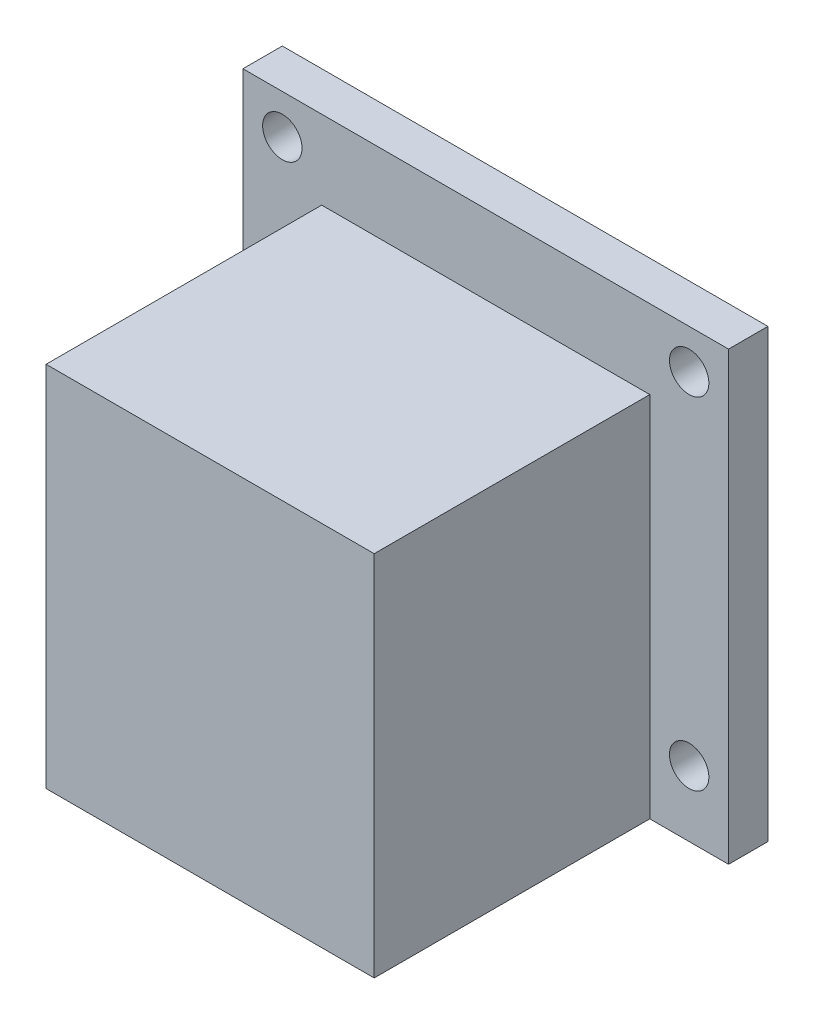
ISO-10303-21;
HEADER;
FILE_DESCRIPTION(('STEP AP214'),'2;1');
FILE_NAME('part.step','',(''),(''),'','','');
FILE_SCHEMA(('AUTOMOTIVE_DESIGN { 1 0 10303 214 1 1 1 1 }'));
ENDSEC;
DATA;
#1=APPLICATION_CONTEXT('core data for automotive mechanical design processes');
#2=APPLICATION_PROTOCOL_DEFINITION('international standard','automotive_design',2000,#1);
#3=PRODUCT_CONTEXT('',#1,'mechanical');
#4=PRODUCT('Part','Part','',(#3));
#5=PRODUCT_RELATED_PRODUCT_CATEGORY('part','',(#4));
#6=PRODUCT_DEFINITION_FORMATION('','',#4);
#7=PRODUCT_DEFINITION_CONTEXT('part definition',#1,'design');
#8=PRODUCT_DEFINITION('design','',#6,#7);
#9=PRODUCT_DEFINITION_SHAPE('','',#8);
#10=(LENGTH_UNIT() NAMED_UNIT(*) SI_UNIT(.MILLI.,.METRE.));
#11=(NAMED_UNIT(*) PLANE_ANGLE_UNIT() SI_UNIT($,.RADIAN.));
#12=(NAMED_UNIT(*) SI_UNIT($,.STERADIAN.) SOLID_ANGLE_UNIT());
#13=UNCERTAINTY_MEASURE_WITH_UNIT(LENGTH_MEASURE(1.E-05),#10,'distance_accuracy_value','');
#14=(GEOMETRIC_REPRESENTATION_CONTEXT(3) GLOBAL_UNCERTAINTY_ASSIGNED_CONTEXT((#13)) GLOBAL_UNIT_ASSIGNED_CONTEXT((#10,
#11,#12)) REPRESENTATION_CONTEXT('',''));
#15=CARTESIAN_POINT('',(0.,0.,0.));
#16=DIRECTION('',(0.,0.,1.));
#17=DIRECTION('',(1.,0.,0.));
#18=AXIS2_PLACEMENT_3D('',#15,#16,#17);
#19=CARTESIAN_POINT('',(0.,0.,0.));
#20=DIRECTION('',(0.,1.,0.));
#21=DIRECTION('',(0.,0.,1.));
#22=AXIS2_PLACEMENT_3D('',#19,#20,#21);
#23=PLANE('',#22);
#24=DIRECTION('',(-1.,0.,0.));
#25=VECTOR('',#24,1.);
#26=CARTESIAN_POINT('',(18.5,0.,-11.5));
#27=LINE('',#26,#25);
#28=CARTESIAN_POINT('',(18.5,0.,-11.5));
#29=VERTEX_POINT('',#28);
#30=CARTESIAN_POINT('',(10.5,0.,-11.5));
#31=VERTEX_POINT('',#30);
#32=EDGE_CURVE('E239',#29,#31,#27,.T.);
#33=ORIENTED_EDGE('',*,*,#32,.F.);
#34=DIRECTION('',(0.,0.,-1.));
#35=VECTOR('',#34,1.);
#36=CARTESIAN_POINT('',(18.5,0.,-8.5));
#37=LINE('',#36,#35);
#38=CARTESIAN_POINT('',(18.5,0.,-8.5));
#39=VERTEX_POINT('',#38);
#40=EDGE_CURVE('E191',#39,#29,#37,.T.);
#41=ORIENTED_EDGE('',*,*,#40,.F.);
#42=DIRECTION('',(-1.,0.,0.));
#43=VECTOR('',#42,1.);
#44=CARTESIAN_POINT('',(18.5,0.,-8.5));
#45=LINE('',#44,#43);
#46=CARTESIAN_POINT('',(12.5,0.,-8.5));
#47=VERTEX_POINT('',#46);
#48=EDGE_CURVE('E189',#39,#47,#45,.T.);
#49=ORIENTED_EDGE('',*,*,#48,.T.);
#50=DIRECTION('',(0.,0.,-1.));
#51=VECTOR('',#50,1.);
#52=CARTESIAN_POINT('',(12.5,0.,12.5));
#53=LINE('',#52,#51);
#54=CARTESIAN_POINT('',(12.5,0.,12.5));
#55=VERTEX_POINT('',#54);
#56=EDGE_CURVE('E176',#55,#47,#53,.T.);
#57=ORIENTED_EDGE('',*,*,#56,.F.);
#58=DIRECTION('',(1.,0.,0.));
#59=VECTOR('',#58,1.);
#60=CARTESIAN_POINT('',(12.5,0.,12.5));
#61=LINE('',#60,#59);
#62=CARTESIAN_POINT('',(-12.5,0.,12.5));
#63=VERTEX_POINT('',#62);
#64=EDGE_CURVE('E174',#63,#55,#61,.T.);
#65=ORIENTED_EDGE('',*,*,#64,.F.);
#66=DIRECTION('',(0.,0.,1.));
#67=VECTOR('',#66,1.);
#68=CARTESIAN_POINT('',(-12.5,0.,12.5));
#69=LINE('',#68,#67);
#70=CARTESIAN_POINT('',(-12.5,0.,-8.5));
#71=VERTEX_POINT('',#70);
#72=EDGE_CURVE('E164',#71,#63,#69,.T.);
#73=ORIENTED_EDGE('',*,*,#72,.F.);
#74=DIRECTION('',(-1.,0.,0.));
#75=VECTOR('',#74,1.);
#76=CARTESIAN_POINT('',(-12.5,0.,-8.49999999999999));
#77=LINE('',#76,#75);
#78=CARTESIAN_POINT('',(-18.5,0.,-8.49999999999999));
#79=VERTEX_POINT('',#78);
#80=EDGE_CURVE('E216',#71,#79,#77,.T.);
#81=ORIENTED_EDGE('',*,*,#80,.T.);
#82=DIRECTION('',(0.,0.,-1.));
#83=VECTOR('',#82,1.);
#84=CARTESIAN_POINT('',(-18.5,0.,-8.49999999999999));
#85=LINE('',#84,#83);
#86=CARTESIAN_POINT('',(-18.5,0.,-11.5));
#87=VERTEX_POINT('',#86);
#88=EDGE_CURVE('E143',#79,#87,#85,.T.);
#89=ORIENTED_EDGE('',*,*,#88,.T.);
#90=DIRECTION('',(-1.,0.,0.));
#91=VECTOR('',#90,1.);
#92=CARTESIAN_POINT('',(-10.5,0.,-11.5));
#93=LINE('',#92,#91);
#94=CARTESIAN_POINT('',(-10.5,0.,-11.5));
#95=VERTEX_POINT('',#94);
#96=EDGE_CURVE('E54',#95,#87,#93,.T.);
#97=ORIENTED_EDGE('',*,*,#96,.F.);
#98=DIRECTION('',(0.,0.,1.));
#99=VECTOR('',#98,1.);
#100=CARTESIAN_POINT('',(-10.5,0.,0.));
#101=LINE('',#100,#99);
#102=CARTESIAN_POINT('',(-10.5,0.,10.5));
#103=VERTEX_POINT('',#102);
#104=EDGE_CURVE('E140',#95,#103,#101,.T.);
#105=ORIENTED_EDGE('',*,*,#104,.T.);
#106=DIRECTION('',(1.,0.,0.));
#107=VECTOR('',#106,1.);
#108=CARTESIAN_POINT('',(0.,0.,10.5));
#109=LINE('',#108,#107);
#110=CARTESIAN_POINT('',(10.5,0.,10.5));
#111=VERTEX_POINT('',#110);
#112=EDGE_CURVE('E150',#103,#111,#109,.T.);
#113=ORIENTED_EDGE('',*,*,#112,.T.);
#114=DIRECTION('',(0.,0.,-1.));
#115=VECTOR('',#114,1.);
#116=CARTESIAN_POINT('',(10.5,0.,0.));
#117=LINE('',#116,#115);
#118=EDGE_CURVE('E153',#111,#31,#117,.T.);
#119=ORIENTED_EDGE('',*,*,#118,.T.);
#120=EDGE_LOOP('',(#33,#41,#49,#57,#65,#73,#81,#89,#97,#105,#113,#119));
#121=FACE_BOUND('',#120,.T.);
#122=ADVANCED_FACE('F39',(#121),#23,.F.);
#123=CARTESIAN_POINT('',(-10.5,25.,12.5));
#124=DIRECTION('',(1.,0.,0.));
#125=DIRECTION('',(0.,0.,-1.));
#126=AXIS2_PLACEMENT_3D('',#123,#124,#125);
#127=PLANE('',#126);
#128=ORIENTED_EDGE('',*,*,#104,.F.);
#129=DIRECTION('',(0.,-1.,0.));
#130=VECTOR('',#129,1.);
#131=CARTESIAN_POINT('',(-10.5,23.,-11.5));
#132=LINE('',#131,#130);
#133=CARTESIAN_POINT('',(-10.5,23.,-11.5));
#134=VERTEX_POINT('',#133);
#135=EDGE_CURVE('E127',#134,#95,#132,.T.);
#136=ORIENTED_EDGE('',*,*,#135,.F.);
#137=DIRECTION('',(0.,0.,1.));
#138=VECTOR('',#137,1.);
#139=CARTESIAN_POINT('',(-10.5,23.,12.5));
#140=LINE('',#139,#138);
#141=CARTESIAN_POINT('',(-10.5,23.,10.5));
#142=VERTEX_POINT('',#141);
#143=EDGE_CURVE('E162',#134,#142,#140,.T.);
#144=ORIENTED_EDGE('',*,*,#143,.T.);
#145=DIRECTION('',(0.,-1.,0.));
#146=VECTOR('',#145,1.);
#147=CARTESIAN_POINT('',(-10.5,25.,10.5));
#148=LINE('',#147,#146);
#149=EDGE_CURVE('E148',#142,#103,#148,.T.);
#150=ORIENTED_EDGE('',*,*,#149,.T.);
#151=EDGE_LOOP('',(#128,#136,#144,#150));
#152=FACE_BOUND('',#151,.T.);
#153=ADVANCED_FACE('F146',(#152),#127,.T.);
#154=CARTESIAN_POINT('',(10.5,25.,12.5));
#155=DIRECTION('',(-1.,0.,0.));
#156=DIRECTION('',(0.,0.,1.));
#157=AXIS2_PLACEMENT_3D('',#154,#155,#156);
#158=PLANE('',#157);
#159=DIRECTION('',(0.,0.,-1.));
#160=VECTOR('',#159,1.);
#161=CARTESIAN_POINT('',(10.5,23.,12.5));
#162=LINE('',#161,#160);
#163=CARTESIAN_POINT('',(10.5,23.,10.5));
#164=VERTEX_POINT('',#163);
#165=CARTESIAN_POINT('',(10.5,23.,-11.5));
#166=VERTEX_POINT('',#165);
#167=EDGE_CURVE('E169',#164,#166,#162,.T.);
#168=ORIENTED_EDGE('',*,*,#167,.T.);
#169=DIRECTION('',(0.,1.,0.));
#170=VECTOR('',#169,1.);
#171=CARTESIAN_POINT('',(10.5,0.,-11.5));
#172=LINE('',#171,#170);
#173=EDGE_CURVE('E241',#31,#166,#172,.T.);
#174=ORIENTED_EDGE('',*,*,#173,.F.);
#175=ORIENTED_EDGE('',*,*,#118,.F.);
#176=DIRECTION('',(0.,-1.,0.));
#177=VECTOR('',#176,1.);
#178=CARTESIAN_POINT('',(10.5,25.,10.5));
#179=LINE('',#178,#177);
#180=EDGE_CURVE('E165',#164,#111,#179,.T.);
#181=ORIENTED_EDGE('',*,*,#180,.F.);
#182=EDGE_LOOP('',(#168,#174,#175,#181));
#183=FACE_BOUND('',#182,.T.);
#184=ADVANCED_FACE('F253',(#183),#158,.T.);
#185=CARTESIAN_POINT('',(0.,23.,0.));
#186=DIRECTION('',(0.,1.,0.));
#187=DIRECTION('',(0.,0.,1.));
#188=AXIS2_PLACEMENT_3D('',#185,#186,#187);
#189=PLANE('',#188);
#190=DIRECTION('',(-1.,0.,0.));
#191=VECTOR('',#190,1.);
#192=CARTESIAN_POINT('',(10.5,23.,-11.5));
#193=LINE('',#192,#191);
#194=EDGE_CURVE('E130',#166,#134,#193,.T.);
#195=ORIENTED_EDGE('',*,*,#194,.F.);
#196=ORIENTED_EDGE('',*,*,#167,.F.);
#197=DIRECTION('',(1.,0.,0.));
#198=VECTOR('',#197,1.);
#199=CARTESIAN_POINT('',(12.5,23.,10.5));
#200=LINE('',#199,#198);
#201=EDGE_CURVE('E167',#142,#164,#200,.T.);
#202=ORIENTED_EDGE('',*,*,#201,.F.);
#203=ORIENTED_EDGE('',*,*,#143,.F.);
#204=EDGE_LOOP('',(#195,#196,#202,#203));
#205=FACE_BOUND('',#204,.T.);
#206=ADVANCED_FACE('F250',(#205),#189,.F.);
#207=CARTESIAN_POINT('',(18.5,34.,-8.5));
#208=DIRECTION('',(1.,0.,0.));
#209=DIRECTION('',(0.,0.,-1.));
#210=AXIS2_PLACEMENT_3D('',#207,#208,#209);
#211=PLANE('',#210);
#212=ORIENTED_EDGE('',*,*,#40,.T.);
#213=DIRECTION('',(0.,-1.,0.));
#214=VECTOR('',#213,1.);
#215=CARTESIAN_POINT('',(18.5,34.,-11.5));
#216=LINE('',#215,#214);
#217=CARTESIAN_POINT('',(18.5,34.,-11.5));
#218=VERTEX_POINT('',#217);
#219=EDGE_CURVE('E235',#218,#29,#216,.T.);
#220=ORIENTED_EDGE('',*,*,#219,.F.);
#221=DIRECTION('',(0.,0.,-1.));
#222=VECTOR('',#221,1.);
#223=CARTESIAN_POINT('',(18.5,34.,-8.5));
#224=LINE('',#223,#222);
#225=CARTESIAN_POINT('',(18.5,34.,-8.5));
#226=VERTEX_POINT('',#225);
#227=EDGE_CURVE('E205',#226,#218,#224,.T.);
#228=ORIENTED_EDGE('',*,*,#227,.F.);
#229=DIRECTION('',(0.,-1.,0.));
#230=VECTOR('',#229,1.);
#231=CARTESIAN_POINT('',(18.5,34.,-8.5));
#232=LINE('',#231,#230);
#233=EDGE_CURVE('E195',#226,#39,#232,.T.);
#234=ORIENTED_EDGE('',*,*,#233,.T.);
#235=EDGE_LOOP('',(#212,#220,#228,#234));
#236=FACE_BOUND('',#235,.T.);
#237=ADVANCED_FACE('F258',(#236),#211,.T.);
#238=CARTESIAN_POINT('',(-18.5,34.,-8.49999999999999));
#239=DIRECTION('',(0.,1.,0.));
#240=DIRECTION('',(-1.,0.,0.));
#241=AXIS2_PLACEMENT_3D('',#238,#239,#240);
#242=PLANE('',#241);
#243=ORIENTED_EDGE('',*,*,#227,.T.);
#244=DIRECTION('',(1.,0.,0.));
#245=VECTOR('',#244,1.);
#246=CARTESIAN_POINT('',(-18.5,34.,-11.5));
#247=LINE('',#246,#245);
#248=CARTESIAN_POINT('',(-18.5,34.,-11.5));
#249=VERTEX_POINT('',#248);
#250=EDGE_CURVE('E233',#249,#218,#247,.T.);
#251=ORIENTED_EDGE('',*,*,#250,.F.);
#252=DIRECTION('',(0.,0.,-1.));
#253=VECTOR('',#252,1.);
#254=CARTESIAN_POINT('',(-18.5,34.,-8.49999999999999));
#255=LINE('',#254,#253);
#256=CARTESIAN_POINT('',(-18.5,34.,-8.49999999999999));
#257=VERTEX_POINT('',#256);
#258=EDGE_CURVE('E197',#257,#249,#255,.T.);
#259=ORIENTED_EDGE('',*,*,#258,.F.);
#260=DIRECTION('',(1.,0.,0.));
#261=VECTOR('',#260,1.);
#262=CARTESIAN_POINT('',(-18.5,34.,-8.49999999999999));
#263=LINE('',#262,#261);
#264=EDGE_CURVE('E199',#257,#226,#263,.T.);
#265=ORIENTED_EDGE('',*,*,#264,.T.);
#266=EDGE_LOOP('',(#243,#251,#259,#265));
#267=FACE_BOUND('',#266,.T.);
#268=ADVANCED_FACE('F229',(#267),#242,.T.);
#269=CARTESIAN_POINT('',(-18.5,0.,-8.49999999999999));
#270=DIRECTION('',(-1.,0.,0.));
#271=DIRECTION('',(0.,0.,1.));
#272=AXIS2_PLACEMENT_3D('',#269,#270,#271);
#273=PLANE('',#272);
#274=ORIENTED_EDGE('',*,*,#258,.T.);
#275=DIRECTION('',(0.,1.,0.));
#276=VECTOR('',#275,1.);
#277=CARTESIAN_POINT('',(-18.5,0.,-11.5));
#278=LINE('',#277,#276);
#279=EDGE_CURVE('E144',#87,#249,#278,.T.);
#280=ORIENTED_EDGE('',*,*,#279,.F.);
#281=ORIENTED_EDGE('',*,*,#88,.F.);
#282=DIRECTION('',(0.,1.,0.));
#283=VECTOR('',#282,1.);
#284=CARTESIAN_POINT('',(-18.5,0.,-8.49999999999999));
#285=LINE('',#284,#283);
#286=EDGE_CURVE('E221',#79,#257,#285,.T.);
#287=ORIENTED_EDGE('',*,*,#286,.T.);
#288=EDGE_LOOP('',(#274,#280,#281,#287));
#289=FACE_BOUND('',#288,.T.);
#290=ADVANCED_FACE('F232',(#289),#273,.T.);
#291=CARTESIAN_POINT('',(-12.5,25.,12.5));
#292=DIRECTION('',(1.,0.,0.));
#293=DIRECTION('',(0.,0.,-1.));
#294=AXIS2_PLACEMENT_3D('',#291,#292,#293);
#295=PLANE('',#294);
#296=DIRECTION('',(0.,-1.,0.));
#297=VECTOR('',#296,1.);
#298=CARTESIAN_POINT('',(-12.5,0.,-8.49999999999999));
#299=LINE('',#298,#297);
#300=CARTESIAN_POINT('',(-12.5,28.,-8.5));
#301=VERTEX_POINT('',#300);
#302=EDGE_CURVE('E62',#301,#71,#299,.T.);
#303=ORIENTED_EDGE('',*,*,#302,.T.);
#304=ORIENTED_EDGE('',*,*,#72,.T.);
#305=DIRECTION('',(0.,-1.,0.));
#306=VECTOR('',#305,1.);
#307=CARTESIAN_POINT('',(-12.5,25.,12.5));
#308=LINE('',#307,#306);
#309=CARTESIAN_POINT('',(-12.5,28.,12.5));
#310=VERTEX_POINT('',#309);
#311=EDGE_CURVE('E11',#310,#63,#308,.T.);
#312=ORIENTED_EDGE('',*,*,#311,.F.);
#313=DIRECTION('',(0.,0.,1.));
#314=VECTOR('',#313,1.);
#315=CARTESIAN_POINT('',(-12.5,28.,-12.5));
#316=LINE('',#315,#314);
#317=EDGE_CURVE('E204',#301,#310,#316,.T.);
#318=ORIENTED_EDGE('',*,*,#317,.F.);
#319=EDGE_LOOP('',(#303,#304,#312,#318));
#320=FACE_BOUND('',#319,.T.);
#321=ADVANCED_FACE('F41',(#320),#295,.F.);
#322=CARTESIAN_POINT('',(12.5,25.,12.5));
#323=DIRECTION('',(-1.,0.,0.));
#324=DIRECTION('',(0.,0.,1.));
#325=AXIS2_PLACEMENT_3D('',#322,#323,#324);
#326=PLANE('',#325);
#327=DIRECTION('',(0.,1.,0.));
#328=VECTOR('',#327,1.);
#329=CARTESIAN_POINT('',(12.5,28.,-8.5));
#330=LINE('',#329,#328);
#331=CARTESIAN_POINT('',(12.5,28.,-8.5));
#332=VERTEX_POINT('',#331);
#333=EDGE_CURVE('E244',#47,#332,#330,.T.);
#334=ORIENTED_EDGE('',*,*,#333,.T.);
#335=DIRECTION('',(0.,0.,-1.));
#336=VECTOR('',#335,1.);
#337=CARTESIAN_POINT('',(12.5,28.,12.5));
#338=LINE('',#337,#336);
#339=CARTESIAN_POINT('',(12.5,28.,12.5));
#340=VERTEX_POINT('',#339);
#341=EDGE_CURVE('E151',#340,#332,#338,.T.);
#342=ORIENTED_EDGE('',*,*,#341,.F.);
#343=DIRECTION('',(0.,-1.,0.));
#344=VECTOR('',#343,1.);
#345=CARTESIAN_POINT('',(12.5,25.,12.5));
#346=LINE('',#345,#344);
#347=EDGE_CURVE('E47',#340,#55,#346,.T.);
#348=ORIENTED_EDGE('',*,*,#347,.T.);
#349=ORIENTED_EDGE('',*,*,#56,.T.);
#350=EDGE_LOOP('',(#334,#342,#348,#349));
#351=FACE_BOUND('',#350,.T.);
#352=ADVANCED_FACE('F181',(#351),#326,.F.);
#353=CARTESIAN_POINT('',(0.,28.,0.));
#354=DIRECTION('',(0.,1.,0.));
#355=DIRECTION('',(0.,0.,1.));
#356=AXIS2_PLACEMENT_3D('',#353,#354,#355);
#357=PLANE('',#356);
#358=ORIENTED_EDGE('',*,*,#341,.T.);
#359=DIRECTION('',(-1.,0.,0.));
#360=VECTOR('',#359,1.);
#361=CARTESIAN_POINT('',(-12.5,28.,-8.49999999999999));
#362=LINE('',#361,#360);
#363=EDGE_CURVE('E224',#332,#301,#362,.T.);
#364=ORIENTED_EDGE('',*,*,#363,.T.);
#365=ORIENTED_EDGE('',*,*,#317,.T.);
#366=DIRECTION('',(1.,0.,0.));
#367=VECTOR('',#366,1.);
#368=CARTESIAN_POINT('',(-12.5,28.,12.5));
#369=LINE('',#368,#367);
#370=EDGE_CURVE('E156',#310,#340,#369,.T.);
#371=ORIENTED_EDGE('',*,*,#370,.T.);
#372=EDGE_LOOP('',(#358,#364,#365,#371));
#373=FACE_BOUND('',#372,.T.);
#374=ADVANCED_FACE('F211',(#373),#357,.T.);
#375=CARTESIAN_POINT('',(12.5,25.,12.5));
#376=DIRECTION('',(0.,0.,-1.));
#377=DIRECTION('',(-1.,0.,0.));
#378=AXIS2_PLACEMENT_3D('',#375,#376,#377);
#379=PLANE('',#378);
#380=ORIENTED_EDGE('',*,*,#64,.T.);
#381=ORIENTED_EDGE('',*,*,#347,.F.);
#382=ORIENTED_EDGE('',*,*,#370,.F.);
#383=ORIENTED_EDGE('',*,*,#311,.T.);
#384=EDGE_LOOP('',(#380,#381,#382,#383));
#385=FACE_BOUND('',#384,.T.);
#386=ADVANCED_FACE('F214',(#385),#379,.F.);
#387=CARTESIAN_POINT('',(12.5,25.,10.5));
#388=DIRECTION('',(0.,0.,-1.));
#389=DIRECTION('',(-1.,0.,0.));
#390=AXIS2_PLACEMENT_3D('',#387,#388,#389);
#391=PLANE('',#390);
#392=ORIENTED_EDGE('',*,*,#180,.T.);
#393=ORIENTED_EDGE('',*,*,#112,.F.);
#394=ORIENTED_EDGE('',*,*,#149,.F.);
#395=ORIENTED_EDGE('',*,*,#201,.T.);
#396=EDGE_LOOP('',(#392,#393,#394,#395));
#397=FACE_BOUND('',#396,.T.);
#398=ADVANCED_FACE('F255',(#397),#391,.T.);
#399=CARTESIAN_POINT('',(0.,0.,-8.5));
#400=DIRECTION('',(0.,0.,-1.));
#401=DIRECTION('',(-1.,0.,0.));
#402=AXIS2_PLACEMENT_3D('',#399,#400,#401);
#403=PLANE('',#402);
#404=CARTESIAN_POINT('',(15.5,31.,-8.5));
#405=DIRECTION('',(0.,0.,-1.));
#406=DIRECTION('',(-1.,0.,0.));
#407=AXIS2_PLACEMENT_3D('',#404,#405,#406);
#408=CIRCLE('',#407,1.5);
#409=CARTESIAN_POINT('',(14.,31.,-8.5));
#410=VERTEX_POINT('',#409);
#411=EDGE_CURVE('E134',#410,#410,#408,.T.);
#412=ORIENTED_EDGE('',*,*,#411,.T.);
#413=EDGE_LOOP('',(#412));
#414=FACE_BOUND('',#413,.T.);
#415=CARTESIAN_POINT('',(-15.5,5.,-8.49999999999999));
#416=DIRECTION('',(0.,0.,-1.));
#417=DIRECTION('',(-1.,0.,0.));
#418=AXIS2_PLACEMENT_3D('',#415,#416,#417);
#419=CIRCLE('',#418,1.5);
#420=CARTESIAN_POINT('',(-17.,5.,-8.49999999999999));
#421=VERTEX_POINT('',#420);
#422=EDGE_CURVE('E441',#421,#421,#419,.T.);
#423=ORIENTED_EDGE('',*,*,#422,.T.);
#424=EDGE_LOOP('',(#423));
#425=FACE_BOUND('',#424,.T.);
#426=CARTESIAN_POINT('',(-15.4999999999998,31.,-8.49999999999999));
#427=DIRECTION('',(0.,0.,-1.));
#428=DIRECTION('',(-1.,0.,0.));
#429=AXIS2_PLACEMENT_3D('',#426,#427,#428);
#430=CIRCLE('',#429,1.5);
#431=CARTESIAN_POINT('',(-16.9999999999998,31.,-8.49999999999999));
#432=VERTEX_POINT('',#431);
#433=EDGE_CURVE('E444',#432,#432,#430,.T.);
#434=ORIENTED_EDGE('',*,*,#433,.T.);
#435=EDGE_LOOP('',(#434));
#436=FACE_BOUND('',#435,.T.);
#437=CARTESIAN_POINT('',(15.5,5.,-8.5));
#438=DIRECTION('',(0.,0.,-1.));
#439=DIRECTION('',(-1.,0.,0.));
#440=AXIS2_PLACEMENT_3D('',#437,#438,#439);
#441=CIRCLE('',#440,1.5);
#442=CARTESIAN_POINT('',(14.,5.,-8.5));
#443=VERTEX_POINT('',#442);
#444=EDGE_CURVE('E449',#443,#443,#441,.T.);
#445=ORIENTED_EDGE('',*,*,#444,.T.);
#446=EDGE_LOOP('',(#445));
#447=FACE_BOUND('',#446,.T.);
#448=ORIENTED_EDGE('',*,*,#333,.F.);
#449=ORIENTED_EDGE('',*,*,#48,.F.);
#450=ORIENTED_EDGE('',*,*,#233,.F.);
#451=ORIENTED_EDGE('',*,*,#264,.F.);
#452=ORIENTED_EDGE('',*,*,#286,.F.);
#453=ORIENTED_EDGE('',*,*,#80,.F.);
#454=ORIENTED_EDGE('',*,*,#302,.F.);
#455=ORIENTED_EDGE('',*,*,#363,.F.);
#456=EDGE_LOOP('',(#448,#449,#450,#451,#452,#453,#454,#455));
#457=FACE_BOUND('',#456,.T.);
#458=ADVANCED_FACE('F218',(#414,#425,#436,#447,#457),#403,.F.);
#459=CARTESIAN_POINT('',(0.,0.,-11.5));
#460=DIRECTION('',(0.,0.,-1.));
#461=DIRECTION('',(-1.,0.,0.));
#462=AXIS2_PLACEMENT_3D('',#459,#460,#461);
#463=PLANE('',#462);
#464=CARTESIAN_POINT('',(15.5,31.,-11.5));
#465=DIRECTION('',(0.,0.,-1.));
#466=DIRECTION('',(-1.,0.,0.));
#467=AXIS2_PLACEMENT_3D('',#464,#465,#466);
#468=CIRCLE('',#467,1.5);
#469=CARTESIAN_POINT('',(14.,31.,-11.5));
#470=VERTEX_POINT('',#469);
#471=EDGE_CURVE('E438',#470,#470,#468,.T.);
#472=ORIENTED_EDGE('',*,*,#471,.F.);
#473=EDGE_LOOP('',(#472));
#474=FACE_BOUND('',#473,.T.);
#475=CARTESIAN_POINT('',(-15.5,5.,-11.5));
#476=DIRECTION('',(0.,0.,-1.));
#477=DIRECTION('',(1.,0.,0.));
#478=AXIS2_PLACEMENT_3D('',#475,#476,#477);
#479=CIRCLE('',#478,1.5);
#480=CARTESIAN_POINT('',(-14.,5.,-11.5));
#481=VERTEX_POINT('',#480);
#482=EDGE_CURVE('E455',#481,#481,#479,.T.);
#483=ORIENTED_EDGE('',*,*,#482,.F.);
#484=EDGE_LOOP('',(#483));
#485=FACE_BOUND('',#484,.T.);
#486=CARTESIAN_POINT('',(-15.4999999999998,31.,-11.5));
#487=DIRECTION('',(0.,0.,-1.));
#488=DIRECTION('',(1.,0.,0.));
#489=AXIS2_PLACEMENT_3D('',#486,#487,#488);
#490=CIRCLE('',#489,1.5);
#491=CARTESIAN_POINT('',(-13.9999999999998,31.,-11.5));
#492=VERTEX_POINT('',#491);
#493=EDGE_CURVE('E458',#492,#492,#490,.T.);
#494=ORIENTED_EDGE('',*,*,#493,.F.);
#495=EDGE_LOOP('',(#494));
#496=FACE_BOUND('',#495,.T.);
#497=CARTESIAN_POINT('',(15.5,5.,-11.5));
#498=DIRECTION('',(0.,0.,-1.));
#499=DIRECTION('',(-1.,0.,0.));
#500=AXIS2_PLACEMENT_3D('',#497,#498,#499);
#501=CIRCLE('',#500,1.5);
#502=CARTESIAN_POINT('',(14.,5.,-11.5));
#503=VERTEX_POINT('',#502);
#504=EDGE_CURVE('E452',#503,#503,#501,.T.);
#505=ORIENTED_EDGE('',*,*,#504,.F.);
#506=EDGE_LOOP('',(#505));
#507=FACE_BOUND('',#506,.T.);
#508=ORIENTED_EDGE('',*,*,#135,.T.);
#509=ORIENTED_EDGE('',*,*,#96,.T.);
#510=ORIENTED_EDGE('',*,*,#279,.T.);
#511=ORIENTED_EDGE('',*,*,#250,.T.);
#512=ORIENTED_EDGE('',*,*,#219,.T.);
#513=ORIENTED_EDGE('',*,*,#32,.T.);
#514=ORIENTED_EDGE('',*,*,#173,.T.);
#515=ORIENTED_EDGE('',*,*,#194,.T.);
#516=EDGE_LOOP('',(#508,#509,#510,#511,#512,#513,#514,#515));
#517=FACE_BOUND('',#516,.T.);
#518=ADVANCED_FACE('F128',(#474,#485,#496,#507,#517),#463,.T.);
#519=CARTESIAN_POINT('',(15.5,5.,12.5));
#520=DIRECTION('',(0.,0.,-1.));
#521=DIRECTION('',(-1.,0.,0.));
#522=AXIS2_PLACEMENT_3D('',#519,#520,#521);
#523=CYLINDRICAL_SURFACE('',#522,1.5);
#524=ORIENTED_EDGE('',*,*,#504,.T.);
#525=EDGE_LOOP('',(#524));
#526=FACE_BOUND('',#525,.T.);
#527=ORIENTED_EDGE('',*,*,#444,.F.);
#528=EDGE_LOOP('',(#527));
#529=FACE_BOUND('',#528,.T.);
#530=ADVANCED_FACE('F369',(#526,#529),#523,.F.);
#531=CARTESIAN_POINT('',(-15.4999999999998,31.,12.5));
#532=DIRECTION('',(0.,0.,-1.));
#533=DIRECTION('',(-1.,0.,0.));
#534=AXIS2_PLACEMENT_3D('',#531,#532,#533);
#535=CYLINDRICAL_SURFACE('',#534,1.5);
#536=ORIENTED_EDGE('',*,*,#493,.T.);
#537=EDGE_LOOP('',(#536));
#538=FACE_BOUND('',#537,.T.);
#539=ORIENTED_EDGE('',*,*,#433,.F.);
#540=EDGE_LOOP('',(#539));
#541=FACE_BOUND('',#540,.T.);
#542=ADVANCED_FACE('F378',(#538,#541),#535,.F.);
#543=CARTESIAN_POINT('',(-15.5,5.,12.5));
#544=DIRECTION('',(0.,0.,-1.));
#545=DIRECTION('',(-1.,0.,0.));
#546=AXIS2_PLACEMENT_3D('',#543,#544,#545);
#547=CYLINDRICAL_SURFACE('',#546,1.5);
#548=ORIENTED_EDGE('',*,*,#482,.T.);
#549=EDGE_LOOP('',(#548));
#550=FACE_BOUND('',#549,.T.);
#551=ORIENTED_EDGE('',*,*,#422,.F.);
#552=EDGE_LOOP('',(#551));
#553=FACE_BOUND('',#552,.T.);
#554=ADVANCED_FACE('F387',(#550,#553),#547,.F.);
#555=CARTESIAN_POINT('',(15.5,31.,12.5));
#556=DIRECTION('',(0.,0.,-1.));
#557=DIRECTION('',(-1.,0.,0.));
#558=AXIS2_PLACEMENT_3D('',#555,#556,#557);
#559=CYLINDRICAL_SURFACE('',#558,1.5);
#560=ORIENTED_EDGE('',*,*,#471,.T.);
#561=EDGE_LOOP('',(#560));
#562=FACE_BOUND('',#561,.T.);
#563=ORIENTED_EDGE('',*,*,#411,.F.);
#564=EDGE_LOOP('',(#563));
#565=FACE_BOUND('',#564,.T.);
#566=ADVANCED_FACE('F396',(#562,#565),#559,.F.);
#567=CLOSED_SHELL('',(#122,#153,#184,#206,#237,#268,#290,#321,#352,#374,#386,#398,#458,#518,
#530,#542,#554,#566));
#568=MANIFOLD_SOLID_BREP('B2',#567);
#569=ADVANCED_BREP_SHAPE_REPRESENTATION('',(#18,#568),#14);
#570=SHAPE_DEFINITION_REPRESENTATION(#9,#569);
ENDSEC;
END-ISO-10303-21;
